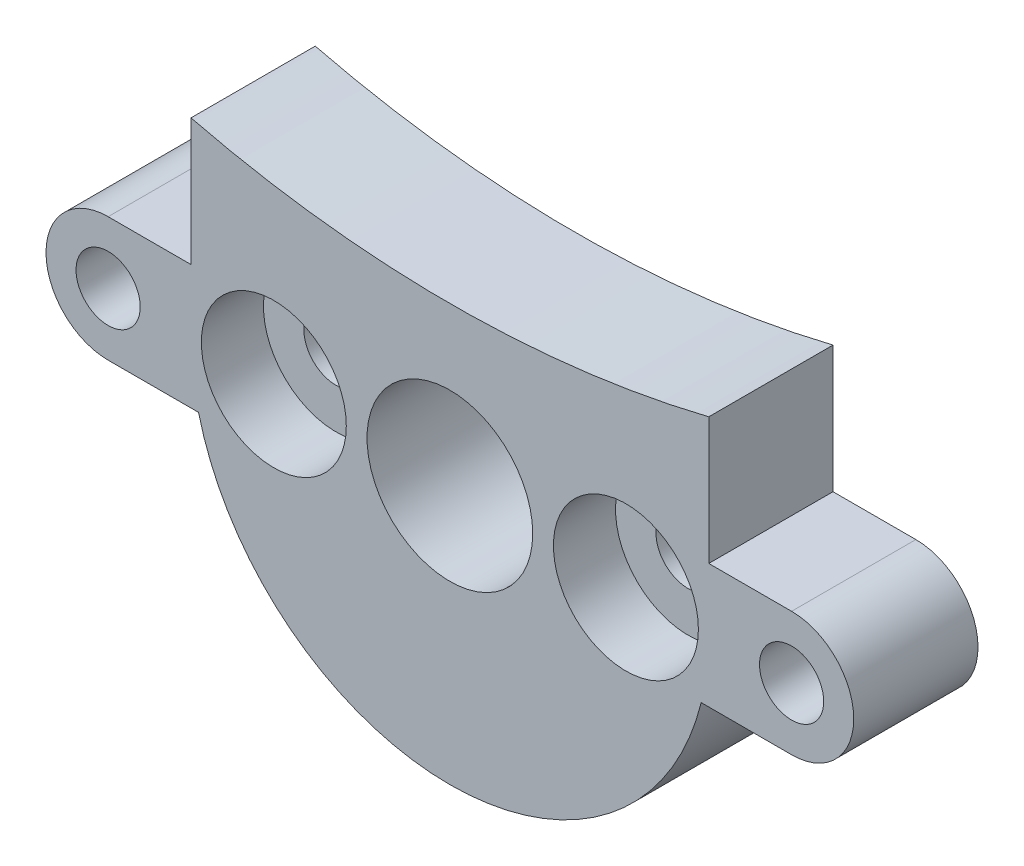
ISO-10303-21;
HEADER;
FILE_DESCRIPTION(('STEP AP214'),'2;1');
FILE_NAME('part.step','',(''),(''),'','','');
FILE_SCHEMA(('AUTOMOTIVE_DESIGN { 1 0 10303 214 1 1 1 1 }'));
ENDSEC;
DATA;
#1=APPLICATION_CONTEXT('core data for automotive mechanical design processes');
#2=APPLICATION_PROTOCOL_DEFINITION('international standard','automotive_design',2000,#1);
#3=PRODUCT_CONTEXT('',#1,'mechanical');
#4=PRODUCT('Part','Part','',(#3));
#5=PRODUCT_RELATED_PRODUCT_CATEGORY('part','',(#4));
#6=PRODUCT_DEFINITION_FORMATION('','',#4);
#7=PRODUCT_DEFINITION_CONTEXT('part definition',#1,'design');
#8=PRODUCT_DEFINITION('design','',#6,#7);
#9=PRODUCT_DEFINITION_SHAPE('','',#8);
#10=(LENGTH_UNIT() NAMED_UNIT(*) SI_UNIT(.MILLI.,.METRE.));
#11=(NAMED_UNIT(*) PLANE_ANGLE_UNIT() SI_UNIT($,.RADIAN.));
#12=(NAMED_UNIT(*) SI_UNIT($,.STERADIAN.) SOLID_ANGLE_UNIT());
#13=UNCERTAINTY_MEASURE_WITH_UNIT(LENGTH_MEASURE(1.E-05),#10,'distance_accuracy_value','');
#14=(GEOMETRIC_REPRESENTATION_CONTEXT(3) GLOBAL_UNCERTAINTY_ASSIGNED_CONTEXT((#13)) GLOBAL_UNIT_ASSIGNED_CONTEXT((#10,
#11,#12)) REPRESENTATION_CONTEXT('',''));
#15=CARTESIAN_POINT('',(0.,0.,0.));
#16=DIRECTION('',(0.,0.,1.));
#17=DIRECTION('',(1.,0.,0.));
#18=AXIS2_PLACEMENT_3D('',#15,#16,#17);
#19=CARTESIAN_POINT('',(-8.5,0.,6.));
#20=DIRECTION('',(0.,0.,-1.));
#21=DIRECTION('',(-1.,0.,0.));
#22=AXIS2_PLACEMENT_3D('',#19,#20,#21);
#23=CYLINDRICAL_SURFACE('',#22,1.55);
#24=CARTESIAN_POINT('',(-8.5,0.,0.));
#25=DIRECTION('',(0.,0.,1.));
#26=DIRECTION('',(1.,0.,0.));
#27=AXIS2_PLACEMENT_3D('',#24,#25,#26);
#28=CIRCLE('',#27,1.55);
#29=CARTESIAN_POINT('',(-6.95,0.,0.));
#30=VERTEX_POINT('',#29);
#31=EDGE_CURVE('E160',#30,#30,#28,.T.);
#32=ORIENTED_EDGE('',*,*,#31,.F.);
#33=EDGE_LOOP('',(#32));
#34=FACE_BOUND('',#33,.T.);
#35=CARTESIAN_POINT('',(-8.5,0.,3.));
#36=DIRECTION('',(0.,0.,1.));
#37=DIRECTION('',(1.,0.,0.));
#38=AXIS2_PLACEMENT_3D('',#35,#36,#37);
#39=CIRCLE('',#38,1.55);
#40=CARTESIAN_POINT('',(-6.95,0.,3.));
#41=VERTEX_POINT('',#40);
#42=EDGE_CURVE('E42',#41,#41,#39,.T.);
#43=ORIENTED_EDGE('',*,*,#42,.T.);
#44=EDGE_LOOP('',(#43));
#45=FACE_BOUND('',#44,.T.);
#46=ADVANCED_FACE('F38',(#34,#45),#23,.F.);
#47=CARTESIAN_POINT('',(8.5,0.,6.));
#48=DIRECTION('',(0.,0.,-1.));
#49=DIRECTION('',(-1.,0.,0.));
#50=AXIS2_PLACEMENT_3D('',#47,#48,#49);
#51=CYLINDRICAL_SURFACE('',#50,1.55);
#52=CARTESIAN_POINT('',(8.5,0.,0.));
#53=DIRECTION('',(0.,0.,1.));
#54=DIRECTION('',(1.,0.,0.));
#55=AXIS2_PLACEMENT_3D('',#52,#53,#54);
#56=CIRCLE('',#55,1.55);
#57=CARTESIAN_POINT('',(10.05,0.,0.));
#58=VERTEX_POINT('',#57);
#59=EDGE_CURVE('E256',#58,#58,#56,.T.);
#60=ORIENTED_EDGE('',*,*,#59,.F.);
#61=EDGE_LOOP('',(#60));
#62=FACE_BOUND('',#61,.T.);
#63=CARTESIAN_POINT('',(8.5,0.,3.));
#64=DIRECTION('',(0.,0.,1.));
#65=DIRECTION('',(1.,0.,0.));
#66=AXIS2_PLACEMENT_3D('',#63,#64,#65);
#67=CIRCLE('',#66,1.55);
#68=CARTESIAN_POINT('',(10.05,0.,3.));
#69=VERTEX_POINT('',#68);
#70=EDGE_CURVE('E209',#69,#69,#67,.T.);
#71=ORIENTED_EDGE('',*,*,#70,.T.);
#72=EDGE_LOOP('',(#71));
#73=FACE_BOUND('',#72,.T.);
#74=ADVANCED_FACE('F314',(#62,#73),#51,.F.);
#75=CARTESIAN_POINT('',(0.,60.0000000000008,6.));
#76=DIRECTION('',(0.,0.,1.));
#77=DIRECTION('',(1.,0.,0.));
#78=AXIS2_PLACEMENT_3D('',#75,#76,#77);
#79=PLANE('',#78);
#80=CARTESIAN_POINT('',(-8.5,0.,6.));
#81=DIRECTION('',(0.,0.,1.));
#82=DIRECTION('',(1.,0.,0.));
#83=AXIS2_PLACEMENT_3D('',#80,#81,#82);
#84=CIRCLE('',#83,3.5);
#85=CARTESIAN_POINT('',(-5.,0.,6.));
#86=VERTEX_POINT('',#85);
#87=EDGE_CURVE('E220',#86,#86,#84,.T.);
#88=ORIENTED_EDGE('',*,*,#87,.F.);
#89=EDGE_LOOP('',(#88));
#90=FACE_BOUND('',#89,.T.);
#91=CARTESIAN_POINT('',(8.5,0.,6.));
#92=DIRECTION('',(0.,0.,1.));
#93=DIRECTION('',(1.,0.,0.));
#94=AXIS2_PLACEMENT_3D('',#91,#92,#93);
#95=CIRCLE('',#94,3.5);
#96=CARTESIAN_POINT('',(12.,0.,6.));
#97=VERTEX_POINT('',#96);
#98=EDGE_CURVE('E232',#97,#97,#95,.T.);
#99=ORIENTED_EDGE('',*,*,#98,.F.);
#100=EDGE_LOOP('',(#99));
#101=FACE_BOUND('',#100,.T.);
#102=CARTESIAN_POINT('',(-16.5,0.,6.));
#103=DIRECTION('',(0.,0.,1.));
#104=DIRECTION('',(1.,0.,0.));
#105=AXIS2_PLACEMENT_3D('',#102,#103,#104);
#106=CIRCLE('',#105,1.55);
#107=CARTESIAN_POINT('',(-14.95,0.,6.));
#108=VERTEX_POINT('',#107);
#109=EDGE_CURVE('E244',#108,#108,#106,.T.);
#110=ORIENTED_EDGE('',*,*,#109,.F.);
#111=EDGE_LOOP('',(#110));
#112=FACE_BOUND('',#111,.T.);
#113=CARTESIAN_POINT('',(0.,60.0000000000008,6.));
#114=DIRECTION('',(0.,0.,-1.));
#115=DIRECTION('',(1.,0.,0.));
#116=AXIS2_PLACEMENT_3D('',#113,#114,#115);
#117=CIRCLE('',#116,52.3808170993934);
#118=CARTESIAN_POINT('',(12.5,9.13252512656031,6.));
#119=VERTEX_POINT('',#118);
#120=CARTESIAN_POINT('',(-12.5,9.13252512656031,6.));
#121=VERTEX_POINT('',#120);
#122=EDGE_CURVE('E184',#119,#121,#117,.T.);
#123=ORIENTED_EDGE('',*,*,#122,.T.);
#124=DIRECTION('',(0.,-1.,0.));
#125=VECTOR('',#124,1.);
#126=CARTESIAN_POINT('',(-12.5,9.13252512656031,6.));
#127=LINE('',#126,#125);
#128=CARTESIAN_POINT('',(-12.5,3.,6.));
#129=VERTEX_POINT('',#128);
#130=EDGE_CURVE('E107',#121,#129,#127,.T.);
#131=ORIENTED_EDGE('',*,*,#130,.T.);
#132=DIRECTION('',(-1.,0.,0.));
#133=VECTOR('',#132,1.);
#134=CARTESIAN_POINT('',(-16.5,3.,6.));
#135=LINE('',#134,#133);
#136=CARTESIAN_POINT('',(-16.5,3.,6.));
#137=VERTEX_POINT('',#136);
#138=EDGE_CURVE('E270',#129,#137,#135,.T.);
#139=ORIENTED_EDGE('',*,*,#138,.T.);
#140=CARTESIAN_POINT('',(-16.5,0.,6.));
#141=DIRECTION('',(0.,0.,1.));
#142=DIRECTION('',(1.,0.,0.));
#143=AXIS2_PLACEMENT_3D('',#140,#141,#142);
#144=CIRCLE('',#143,3.);
#145=CARTESIAN_POINT('',(-16.5,-3.,6.));
#146=VERTEX_POINT('',#145);
#147=EDGE_CURVE('E273',#137,#146,#144,.T.);
#148=ORIENTED_EDGE('',*,*,#147,.T.);
#149=DIRECTION('',(1.,0.,0.));
#150=VECTOR('',#149,1.);
#151=CARTESIAN_POINT('',(-16.5,-3.,6.));
#152=LINE('',#151,#150);
#153=CARTESIAN_POINT('',(-12.1346610995116,-3.,6.));
#154=VERTEX_POINT('',#153);
#155=EDGE_CURVE('E276',#146,#154,#152,.T.);
#156=ORIENTED_EDGE('',*,*,#155,.T.);
#157=CARTESIAN_POINT('',(0.,0.,6.));
#158=DIRECTION('',(0.,0.,1.));
#159=DIRECTION('',(1.,0.,0.));
#160=AXIS2_PLACEMENT_3D('',#157,#158,#159);
#161=CIRCLE('',#160,12.5);
#162=CARTESIAN_POINT('',(12.1346610995116,-3.,6.));
#163=VERTEX_POINT('',#162);
#164=EDGE_CURVE('E279',#154,#163,#161,.T.);
#165=ORIENTED_EDGE('',*,*,#164,.T.);
#166=DIRECTION('',(1.,0.,0.));
#167=VECTOR('',#166,1.);
#168=CARTESIAN_POINT('',(16.5,-3.,6.));
#169=LINE('',#168,#167);
#170=CARTESIAN_POINT('',(16.5,-3.,6.));
#171=VERTEX_POINT('',#170);
#172=EDGE_CURVE('E133',#163,#171,#169,.T.);
#173=ORIENTED_EDGE('',*,*,#172,.T.);
#174=CARTESIAN_POINT('',(16.5,0.,6.));
#175=DIRECTION('',(0.,0.,1.));
#176=DIRECTION('',(-1.,0.,0.));
#177=AXIS2_PLACEMENT_3D('',#174,#175,#176);
#178=CIRCLE('',#177,3.);
#179=CARTESIAN_POINT('',(16.5,3.,6.));
#180=VERTEX_POINT('',#179);
#181=EDGE_CURVE('E126',#171,#180,#178,.T.);
#182=ORIENTED_EDGE('',*,*,#181,.T.);
#183=DIRECTION('',(-1.,0.,0.));
#184=VECTOR('',#183,1.);
#185=CARTESIAN_POINT('',(16.5,3.,6.));
#186=LINE('',#185,#184);
#187=CARTESIAN_POINT('',(12.5,3.,6.));
#188=VERTEX_POINT('',#187);
#189=EDGE_CURVE('E131',#180,#188,#186,.T.);
#190=ORIENTED_EDGE('',*,*,#189,.T.);
#191=DIRECTION('',(0.,1.,0.));
#192=VECTOR('',#191,1.);
#193=CARTESIAN_POINT('',(12.5,3.,6.));
#194=LINE('',#193,#192);
#195=EDGE_CURVE('E58',#188,#119,#194,.T.);
#196=ORIENTED_EDGE('',*,*,#195,.T.);
#197=EDGE_LOOP('',(#123,#131,#139,#148,#156,#165,#173,#182,#190,#196));
#198=FACE_BOUND('',#197,.T.);
#199=CARTESIAN_POINT('',(16.5,0.,6.));
#200=DIRECTION('',(0.,0.,1.));
#201=DIRECTION('',(1.,0.,0.));
#202=AXIS2_PLACEMENT_3D('',#199,#200,#201);
#203=CIRCLE('',#202,1.55);
#204=CARTESIAN_POINT('',(18.05,0.,6.));
#205=VERTEX_POINT('',#204);
#206=EDGE_CURVE('E252',#205,#205,#203,.T.);
#207=ORIENTED_EDGE('',*,*,#206,.F.);
#208=EDGE_LOOP('',(#207));
#209=FACE_BOUND('',#208,.T.);
#210=CARTESIAN_POINT('',(0.,0.,6.));
#211=DIRECTION('',(0.,0.,1.));
#212=DIRECTION('',(1.,0.,0.));
#213=AXIS2_PLACEMENT_3D('',#210,#211,#212);
#214=CIRCLE('',#213,4.);
#215=CARTESIAN_POINT('',(4.,0.,6.));
#216=VERTEX_POINT('',#215);
#217=EDGE_CURVE('E236',#216,#216,#214,.T.);
#218=ORIENTED_EDGE('',*,*,#217,.F.);
#219=EDGE_LOOP('',(#218));
#220=FACE_BOUND('',#219,.T.);
#221=ADVANCED_FACE('F128',(#90,#101,#112,#198,#209,#220),#79,.T.);
#222=CARTESIAN_POINT('',(0.,60.0000000000008,0.));
#223=DIRECTION('',(0.,0.,1.));
#224=DIRECTION('',(1.,0.,0.));
#225=AXIS2_PLACEMENT_3D('',#222,#223,#224);
#226=PLANE('',#225);
#227=CARTESIAN_POINT('',(0.,60.0000000000008,0.));
#228=DIRECTION('',(0.,0.,-1.));
#229=DIRECTION('',(1.,0.,0.));
#230=AXIS2_PLACEMENT_3D('',#227,#228,#229);
#231=CIRCLE('',#230,52.3808170993934);
#232=CARTESIAN_POINT('',(12.5,9.13252512656031,0.));
#233=VERTEX_POINT('',#232);
#234=CARTESIAN_POINT('',(-12.5,9.13252512656031,0.));
#235=VERTEX_POINT('',#234);
#236=EDGE_CURVE('E155',#233,#235,#231,.T.);
#237=ORIENTED_EDGE('',*,*,#236,.F.);
#238=DIRECTION('',(0.,1.,0.));
#239=VECTOR('',#238,1.);
#240=CARTESIAN_POINT('',(12.5,3.,0.));
#241=LINE('',#240,#239);
#242=CARTESIAN_POINT('',(12.5,3.,0.));
#243=VERTEX_POINT('',#242);
#244=EDGE_CURVE('E99',#243,#233,#241,.T.);
#245=ORIENTED_EDGE('',*,*,#244,.F.);
#246=DIRECTION('',(-1.,0.,0.));
#247=VECTOR('',#246,1.);
#248=CARTESIAN_POINT('',(16.5,3.,0.));
#249=LINE('',#248,#247);
#250=CARTESIAN_POINT('',(16.5,3.,0.));
#251=VERTEX_POINT('',#250);
#252=EDGE_CURVE('E93',#251,#243,#249,.T.);
#253=ORIENTED_EDGE('',*,*,#252,.F.);
#254=CARTESIAN_POINT('',(16.5,0.,0.));
#255=DIRECTION('',(0.,0.,1.));
#256=DIRECTION('',(-1.,0.,0.));
#257=AXIS2_PLACEMENT_3D('',#254,#255,#256);
#258=CIRCLE('',#257,3.);
#259=CARTESIAN_POINT('',(16.5,-3.,0.));
#260=VERTEX_POINT('',#259);
#261=EDGE_CURVE('E142',#260,#251,#258,.T.);
#262=ORIENTED_EDGE('',*,*,#261,.F.);
#263=DIRECTION('',(1.,0.,0.));
#264=VECTOR('',#263,1.);
#265=CARTESIAN_POINT('',(16.5,-3.,0.));
#266=LINE('',#265,#264);
#267=CARTESIAN_POINT('',(12.1346610995116,-3.,0.));
#268=VERTEX_POINT('',#267);
#269=EDGE_CURVE('E175',#268,#260,#266,.T.);
#270=ORIENTED_EDGE('',*,*,#269,.F.);
#271=CARTESIAN_POINT('',(0.,0.,0.));
#272=DIRECTION('',(0.,0.,1.));
#273=DIRECTION('',(1.,0.,0.));
#274=AXIS2_PLACEMENT_3D('',#271,#272,#273);
#275=CIRCLE('',#274,12.5);
#276=CARTESIAN_POINT('',(-12.1346610995116,-3.,0.));
#277=VERTEX_POINT('',#276);
#278=EDGE_CURVE('E172',#277,#268,#275,.T.);
#279=ORIENTED_EDGE('',*,*,#278,.F.);
#280=DIRECTION('',(1.,0.,0.));
#281=VECTOR('',#280,1.);
#282=CARTESIAN_POINT('',(-16.5,-3.,0.));
#283=LINE('',#282,#281);
#284=CARTESIAN_POINT('',(-16.5,-3.,0.));
#285=VERTEX_POINT('',#284);
#286=EDGE_CURVE('E169',#285,#277,#283,.T.);
#287=ORIENTED_EDGE('',*,*,#286,.F.);
#288=CARTESIAN_POINT('',(-16.5,0.,0.));
#289=DIRECTION('',(0.,0.,1.));
#290=DIRECTION('',(1.,0.,0.));
#291=AXIS2_PLACEMENT_3D('',#288,#289,#290);
#292=CIRCLE('',#291,3.);
#293=CARTESIAN_POINT('',(-16.5,3.,0.));
#294=VERTEX_POINT('',#293);
#295=EDGE_CURVE('E166',#294,#285,#292,.T.);
#296=ORIENTED_EDGE('',*,*,#295,.F.);
#297=DIRECTION('',(-1.,0.,0.));
#298=VECTOR('',#297,1.);
#299=CARTESIAN_POINT('',(-16.5,3.,0.));
#300=LINE('',#299,#298);
#301=CARTESIAN_POINT('',(-12.5,3.,0.));
#302=VERTEX_POINT('',#301);
#303=EDGE_CURVE('E163',#302,#294,#300,.T.);
#304=ORIENTED_EDGE('',*,*,#303,.F.);
#305=DIRECTION('',(0.,-1.,0.));
#306=VECTOR('',#305,1.);
#307=CARTESIAN_POINT('',(-12.5,9.13252512656031,0.));
#308=LINE('',#307,#306);
#309=EDGE_CURVE('E159',#235,#302,#308,.T.);
#310=ORIENTED_EDGE('',*,*,#309,.F.);
#311=EDGE_LOOP('',(#237,#245,#253,#262,#270,#279,#287,#296,#304,#310));
#312=FACE_BOUND('',#311,.T.);
#313=ORIENTED_EDGE('',*,*,#31,.T.);
#314=EDGE_LOOP('',(#313));
#315=FACE_BOUND('',#314,.T.);
#316=ORIENTED_EDGE('',*,*,#59,.T.);
#317=EDGE_LOOP('',(#316));
#318=FACE_BOUND('',#317,.T.);
#319=CARTESIAN_POINT('',(16.5,0.,0.));
#320=DIRECTION('',(0.,0.,1.));
#321=DIRECTION('',(1.,0.,0.));
#322=AXIS2_PLACEMENT_3D('',#319,#320,#321);
#323=CIRCLE('',#322,1.55);
#324=CARTESIAN_POINT('',(18.05,0.,0.));
#325=VERTEX_POINT('',#324);
#326=EDGE_CURVE('E248',#325,#325,#323,.T.);
#327=ORIENTED_EDGE('',*,*,#326,.T.);
#328=EDGE_LOOP('',(#327));
#329=FACE_BOUND('',#328,.T.);
#330=CARTESIAN_POINT('',(-16.5,0.,0.));
#331=DIRECTION('',(0.,0.,1.));
#332=DIRECTION('',(1.,0.,0.));
#333=AXIS2_PLACEMENT_3D('',#330,#331,#332);
#334=CIRCLE('',#333,1.55);
#335=CARTESIAN_POINT('',(-14.95,0.,0.));
#336=VERTEX_POINT('',#335);
#337=EDGE_CURVE('E240',#336,#336,#334,.T.);
#338=ORIENTED_EDGE('',*,*,#337,.T.);
#339=EDGE_LOOP('',(#338));
#340=FACE_BOUND('',#339,.T.);
#341=CARTESIAN_POINT('',(0.,0.,0.));
#342=DIRECTION('',(0.,0.,1.));
#343=DIRECTION('',(1.,0.,0.));
#344=AXIS2_PLACEMENT_3D('',#341,#342,#343);
#345=CIRCLE('',#344,4.);
#346=CARTESIAN_POINT('',(4.,0.,0.));
#347=VERTEX_POINT('',#346);
#348=EDGE_CURVE('E218',#347,#347,#345,.T.);
#349=ORIENTED_EDGE('',*,*,#348,.T.);
#350=EDGE_LOOP('',(#349));
#351=FACE_BOUND('',#350,.T.);
#352=ADVANCED_FACE('F294',(#312,#315,#318,#329,#340,#351),#226,.F.);
#353=CARTESIAN_POINT('',(0.,60.0000000000008,6.));
#354=DIRECTION('',(0.,0.,-1.));
#355=DIRECTION('',(-1.,0.,0.));
#356=AXIS2_PLACEMENT_3D('',#353,#354,#355);
#357=CYLINDRICAL_SURFACE('',#356,52.3808170993934);
#358=ORIENTED_EDGE('',*,*,#236,.T.);
#359=DIRECTION('',(0.,0.,-1.));
#360=VECTOR('',#359,1.);
#361=CARTESIAN_POINT('',(-12.5,9.13252512656031,6.));
#362=LINE('',#361,#360);
#363=EDGE_CURVE('E11',#121,#235,#362,.T.);
#364=ORIENTED_EDGE('',*,*,#363,.F.);
#365=ORIENTED_EDGE('',*,*,#122,.F.);
#366=DIRECTION('',(0.,0.,-1.));
#367=VECTOR('',#366,1.);
#368=CARTESIAN_POINT('',(12.5,9.13252512656031,6.));
#369=LINE('',#368,#367);
#370=EDGE_CURVE('E151',#119,#233,#369,.T.);
#371=ORIENTED_EDGE('',*,*,#370,.T.);
#372=EDGE_LOOP('',(#358,#364,#365,#371));
#373=FACE_BOUND('',#372,.T.);
#374=ADVANCED_FACE('F40',(#373),#357,.F.);
#375=CARTESIAN_POINT('',(-12.5,9.13252512656031,6.));
#376=DIRECTION('',(1.,0.,0.));
#377=DIRECTION('',(0.,0.,-1.));
#378=AXIS2_PLACEMENT_3D('',#375,#376,#377);
#379=PLANE('',#378);
#380=ORIENTED_EDGE('',*,*,#309,.T.);
#381=DIRECTION('',(0.,0.,-1.));
#382=VECTOR('',#381,1.);
#383=CARTESIAN_POINT('',(-12.5,3.,6.));
#384=LINE('',#383,#382);
#385=EDGE_CURVE('E49',#129,#302,#384,.T.);
#386=ORIENTED_EDGE('',*,*,#385,.F.);
#387=ORIENTED_EDGE('',*,*,#130,.F.);
#388=ORIENTED_EDGE('',*,*,#363,.T.);
#389=EDGE_LOOP('',(#380,#386,#387,#388));
#390=FACE_BOUND('',#389,.T.);
#391=ADVANCED_FACE('F333',(#390),#379,.F.);
#392=CARTESIAN_POINT('',(-16.5,3.,6.));
#393=DIRECTION('',(0.,-1.,0.));
#394=DIRECTION('',(0.,0.,-1.));
#395=AXIS2_PLACEMENT_3D('',#392,#393,#394);
#396=PLANE('',#395);
#397=ORIENTED_EDGE('',*,*,#303,.T.);
#398=DIRECTION('',(0.,0.,-1.));
#399=VECTOR('',#398,1.);
#400=CARTESIAN_POINT('',(-16.5,3.,6.));
#401=LINE('',#400,#399);
#402=EDGE_CURVE('E203',#137,#294,#401,.T.);
#403=ORIENTED_EDGE('',*,*,#402,.F.);
#404=ORIENTED_EDGE('',*,*,#138,.F.);
#405=ORIENTED_EDGE('',*,*,#385,.T.);
#406=EDGE_LOOP('',(#397,#403,#404,#405));
#407=FACE_BOUND('',#406,.T.);
#408=ADVANCED_FACE('F337',(#407),#396,.F.);
#409=CARTESIAN_POINT('',(-16.5,0.,6.));
#410=DIRECTION('',(0.,0.,-1.));
#411=DIRECTION('',(-1.,0.,0.));
#412=AXIS2_PLACEMENT_3D('',#409,#410,#411);
#413=CYLINDRICAL_SURFACE('',#412,3.);
#414=ORIENTED_EDGE('',*,*,#295,.T.);
#415=DIRECTION('',(0.,0.,-1.));
#416=VECTOR('',#415,1.);
#417=CARTESIAN_POINT('',(-16.5,-3.,6.));
#418=LINE('',#417,#416);
#419=EDGE_CURVE('E199',#146,#285,#418,.T.);
#420=ORIENTED_EDGE('',*,*,#419,.F.);
#421=ORIENTED_EDGE('',*,*,#147,.F.);
#422=ORIENTED_EDGE('',*,*,#402,.T.);
#423=EDGE_LOOP('',(#414,#420,#421,#422));
#424=FACE_BOUND('',#423,.T.);
#425=ADVANCED_FACE('F341',(#424),#413,.T.);
#426=CARTESIAN_POINT('',(-16.5,-3.,6.));
#427=DIRECTION('',(0.,1.,0.));
#428=DIRECTION('',(0.,0.,1.));
#429=AXIS2_PLACEMENT_3D('',#426,#427,#428);
#430=PLANE('',#429);
#431=ORIENTED_EDGE('',*,*,#286,.T.);
#432=DIRECTION('',(0.,0.,-1.));
#433=VECTOR('',#432,1.);
#434=CARTESIAN_POINT('',(-12.1346610995116,-3.,6.));
#435=LINE('',#434,#433);
#436=EDGE_CURVE('E195',#154,#277,#435,.T.);
#437=ORIENTED_EDGE('',*,*,#436,.F.);
#438=ORIENTED_EDGE('',*,*,#155,.F.);
#439=ORIENTED_EDGE('',*,*,#419,.T.);
#440=EDGE_LOOP('',(#431,#437,#438,#439));
#441=FACE_BOUND('',#440,.T.);
#442=ADVANCED_FACE('F347',(#441),#430,.F.);
#443=CARTESIAN_POINT('',(0.,0.,6.));
#444=DIRECTION('',(0.,0.,-1.));
#445=DIRECTION('',(-1.,0.,0.));
#446=AXIS2_PLACEMENT_3D('',#443,#444,#445);
#447=CYLINDRICAL_SURFACE('',#446,12.5);
#448=ORIENTED_EDGE('',*,*,#278,.T.);
#449=DIRECTION('',(0.,0.,-1.));
#450=VECTOR('',#449,1.);
#451=CARTESIAN_POINT('',(12.1346610995116,-3.,6.));
#452=LINE('',#451,#450);
#453=EDGE_CURVE('E191',#163,#268,#452,.T.);
#454=ORIENTED_EDGE('',*,*,#453,.F.);
#455=ORIENTED_EDGE('',*,*,#164,.F.);
#456=ORIENTED_EDGE('',*,*,#436,.T.);
#457=EDGE_LOOP('',(#448,#454,#455,#456));
#458=FACE_BOUND('',#457,.T.);
#459=ADVANCED_FACE('F287',(#458),#447,.T.);
#460=CARTESIAN_POINT('',(16.5,-3.,6.));
#461=DIRECTION('',(0.,1.,0.));
#462=DIRECTION('',(0.,0.,1.));
#463=AXIS2_PLACEMENT_3D('',#460,#461,#462);
#464=PLANE('',#463);
#465=ORIENTED_EDGE('',*,*,#269,.T.);
#466=DIRECTION('',(0.,0.,-1.));
#467=VECTOR('',#466,1.);
#468=CARTESIAN_POINT('',(16.5,-3.,6.));
#469=LINE('',#468,#467);
#470=EDGE_CURVE('E144',#171,#260,#469,.T.);
#471=ORIENTED_EDGE('',*,*,#470,.F.);
#472=ORIENTED_EDGE('',*,*,#172,.F.);
#473=ORIENTED_EDGE('',*,*,#453,.T.);
#474=EDGE_LOOP('',(#465,#471,#472,#473));
#475=FACE_BOUND('',#474,.T.);
#476=ADVANCED_FACE('F291',(#475),#464,.F.);
#477=CARTESIAN_POINT('',(16.5,0.,6.));
#478=DIRECTION('',(0.,0.,-1.));
#479=DIRECTION('',(-1.,0.,0.));
#480=AXIS2_PLACEMENT_3D('',#477,#478,#479);
#481=CYLINDRICAL_SURFACE('',#480,3.);
#482=ORIENTED_EDGE('',*,*,#261,.T.);
#483=DIRECTION('',(0.,0.,-1.));
#484=VECTOR('',#483,1.);
#485=CARTESIAN_POINT('',(16.5,3.,6.));
#486=LINE('',#485,#484);
#487=EDGE_CURVE('E139',#180,#251,#486,.T.);
#488=ORIENTED_EDGE('',*,*,#487,.F.);
#489=ORIENTED_EDGE('',*,*,#181,.F.);
#490=ORIENTED_EDGE('',*,*,#470,.T.);
#491=EDGE_LOOP('',(#482,#488,#489,#490));
#492=FACE_BOUND('',#491,.T.);
#493=ADVANCED_FACE('F140',(#492),#481,.T.);
#494=CARTESIAN_POINT('',(16.5,3.,6.));
#495=DIRECTION('',(0.,-1.,0.));
#496=DIRECTION('',(0.,0.,-1.));
#497=AXIS2_PLACEMENT_3D('',#494,#495,#496);
#498=PLANE('',#497);
#499=ORIENTED_EDGE('',*,*,#252,.T.);
#500=DIRECTION('',(0.,0.,-1.));
#501=VECTOR('',#500,1.);
#502=CARTESIAN_POINT('',(12.5,3.,6.));
#503=LINE('',#502,#501);
#504=EDGE_CURVE('E145',#188,#243,#503,.T.);
#505=ORIENTED_EDGE('',*,*,#504,.F.);
#506=ORIENTED_EDGE('',*,*,#189,.F.);
#507=ORIENTED_EDGE('',*,*,#487,.T.);
#508=EDGE_LOOP('',(#499,#505,#506,#507));
#509=FACE_BOUND('',#508,.T.);
#510=ADVANCED_FACE('F147',(#509),#498,.F.);
#511=CARTESIAN_POINT('',(12.5,3.,6.));
#512=DIRECTION('',(-1.,0.,0.));
#513=DIRECTION('',(0.,0.,1.));
#514=AXIS2_PLACEMENT_3D('',#511,#512,#513);
#515=PLANE('',#514);
#516=ORIENTED_EDGE('',*,*,#244,.T.);
#517=ORIENTED_EDGE('',*,*,#370,.F.);
#518=ORIENTED_EDGE('',*,*,#195,.F.);
#519=ORIENTED_EDGE('',*,*,#504,.T.);
#520=EDGE_LOOP('',(#516,#517,#518,#519));
#521=FACE_BOUND('',#520,.T.);
#522=ADVANCED_FACE('F300',(#521),#515,.F.);
#523=CARTESIAN_POINT('',(16.5,0.,6.));
#524=DIRECTION('',(0.,0.,-1.));
#525=DIRECTION('',(-1.,0.,0.));
#526=AXIS2_PLACEMENT_3D('',#523,#524,#525);
#527=CYLINDRICAL_SURFACE('',#526,1.55);
#528=ORIENTED_EDGE('',*,*,#206,.T.);
#529=EDGE_LOOP('',(#528));
#530=FACE_BOUND('',#529,.T.);
#531=ORIENTED_EDGE('',*,*,#326,.F.);
#532=EDGE_LOOP('',(#531));
#533=FACE_BOUND('',#532,.T.);
#534=ADVANCED_FACE('F302',(#530,#533),#527,.F.);
#535=CARTESIAN_POINT('',(-16.5,0.,6.));
#536=DIRECTION('',(0.,0.,-1.));
#537=DIRECTION('',(-1.,0.,0.));
#538=AXIS2_PLACEMENT_3D('',#535,#536,#537);
#539=CYLINDRICAL_SURFACE('',#538,1.55);
#540=ORIENTED_EDGE('',*,*,#109,.T.);
#541=EDGE_LOOP('',(#540));
#542=FACE_BOUND('',#541,.T.);
#543=ORIENTED_EDGE('',*,*,#337,.F.);
#544=EDGE_LOOP('',(#543));
#545=FACE_BOUND('',#544,.T.);
#546=ADVANCED_FACE('F308',(#542,#545),#539,.F.);
#547=CARTESIAN_POINT('',(0.,0.,6.));
#548=DIRECTION('',(0.,0.,-1.));
#549=DIRECTION('',(-1.,0.,0.));
#550=AXIS2_PLACEMENT_3D('',#547,#548,#549);
#551=CYLINDRICAL_SURFACE('',#550,4.);
#552=ORIENTED_EDGE('',*,*,#217,.T.);
#553=EDGE_LOOP('',(#552));
#554=FACE_BOUND('',#553,.T.);
#555=ORIENTED_EDGE('',*,*,#348,.F.);
#556=EDGE_LOOP('',(#555));
#557=FACE_BOUND('',#556,.T.);
#558=ADVANCED_FACE('F383',(#554,#557),#551,.F.);
#559=CARTESIAN_POINT('',(8.5,0.,3.));
#560=DIRECTION('',(0.,0.,1.));
#561=DIRECTION('',(1.,0.,0.));
#562=AXIS2_PLACEMENT_3D('',#559,#560,#561);
#563=CYLINDRICAL_SURFACE('',#562,3.5);
#564=CARTESIAN_POINT('',(8.5,0.,3.));
#565=DIRECTION('',(0.,0.,1.));
#566=DIRECTION('',(1.,0.,0.));
#567=AXIS2_PLACEMENT_3D('',#564,#565,#566);
#568=CIRCLE('',#567,3.5);
#569=CARTESIAN_POINT('',(12.,0.,3.));
#570=VERTEX_POINT('',#569);
#571=EDGE_CURVE('E226',#570,#570,#568,.T.);
#572=ORIENTED_EDGE('',*,*,#571,.F.);
#573=EDGE_LOOP('',(#572));
#574=FACE_BOUND('',#573,.T.);
#575=ORIENTED_EDGE('',*,*,#98,.T.);
#576=EDGE_LOOP('',(#575));
#577=FACE_BOUND('',#576,.T.);
#578=ADVANCED_FACE('F392',(#574,#577),#563,.F.);
#579=CARTESIAN_POINT('',(8.5,0.,3.));
#580=DIRECTION('',(0.,0.,1.));
#581=DIRECTION('',(1.,0.,0.));
#582=AXIS2_PLACEMENT_3D('',#579,#580,#581);
#583=PLANE('',#582);
#584=ORIENTED_EDGE('',*,*,#70,.F.);
#585=EDGE_LOOP('',(#584));
#586=FACE_BOUND('',#585,.T.);
#587=ORIENTED_EDGE('',*,*,#571,.T.);
#588=EDGE_LOOP('',(#587));
#589=FACE_BOUND('',#588,.T.);
#590=ADVANCED_FACE('F412',(#586,#589),#583,.T.);
#591=CARTESIAN_POINT('',(-8.5,0.,3.));
#592=DIRECTION('',(0.,0.,1.));
#593=DIRECTION('',(1.,0.,0.));
#594=AXIS2_PLACEMENT_3D('',#591,#592,#593);
#595=CYLINDRICAL_SURFACE('',#594,3.5);
#596=CARTESIAN_POINT('',(-8.5,0.,3.));
#597=DIRECTION('',(0.,0.,1.));
#598=DIRECTION('',(1.,0.,0.));
#599=AXIS2_PLACEMENT_3D('',#596,#597,#598);
#600=CIRCLE('',#599,3.5);
#601=CARTESIAN_POINT('',(-5.,0.,3.));
#602=VERTEX_POINT('',#601);
#603=EDGE_CURVE('E212',#602,#602,#600,.T.);
#604=ORIENTED_EDGE('',*,*,#603,.F.);
#605=EDGE_LOOP('',(#604));
#606=FACE_BOUND('',#605,.T.);
#607=ORIENTED_EDGE('',*,*,#87,.T.);
#608=EDGE_LOOP('',(#607));
#609=FACE_BOUND('',#608,.T.);
#610=ADVANCED_FACE('F419',(#606,#609),#595,.F.);
#611=CARTESIAN_POINT('',(-8.5,0.,3.));
#612=DIRECTION('',(0.,0.,1.));
#613=DIRECTION('',(1.,0.,0.));
#614=AXIS2_PLACEMENT_3D('',#611,#612,#613);
#615=PLANE('',#614);
#616=ORIENTED_EDGE('',*,*,#42,.F.);
#617=EDGE_LOOP('',(#616));
#618=FACE_BOUND('',#617,.T.);
#619=ORIENTED_EDGE('',*,*,#603,.T.);
#620=EDGE_LOOP('',(#619));
#621=FACE_BOUND('',#620,.T.);
#622=ADVANCED_FACE('F427',(#618,#621),#615,.T.);
#623=CLOSED_SHELL('',(#46,#74,#221,#352,#374,#391,#408,#425,#442,#459,#476,#493,#510,#522,#534,
#546,#558,#578,#590,#610,#622));
#624=MANIFOLD_SOLID_BREP('B2',#623);
#625=ADVANCED_BREP_SHAPE_REPRESENTATION('',(#18,#624),#14);
#626=SHAPE_DEFINITION_REPRESENTATION(#9,#625);
ENDSEC;
END-ISO-10303-21;
